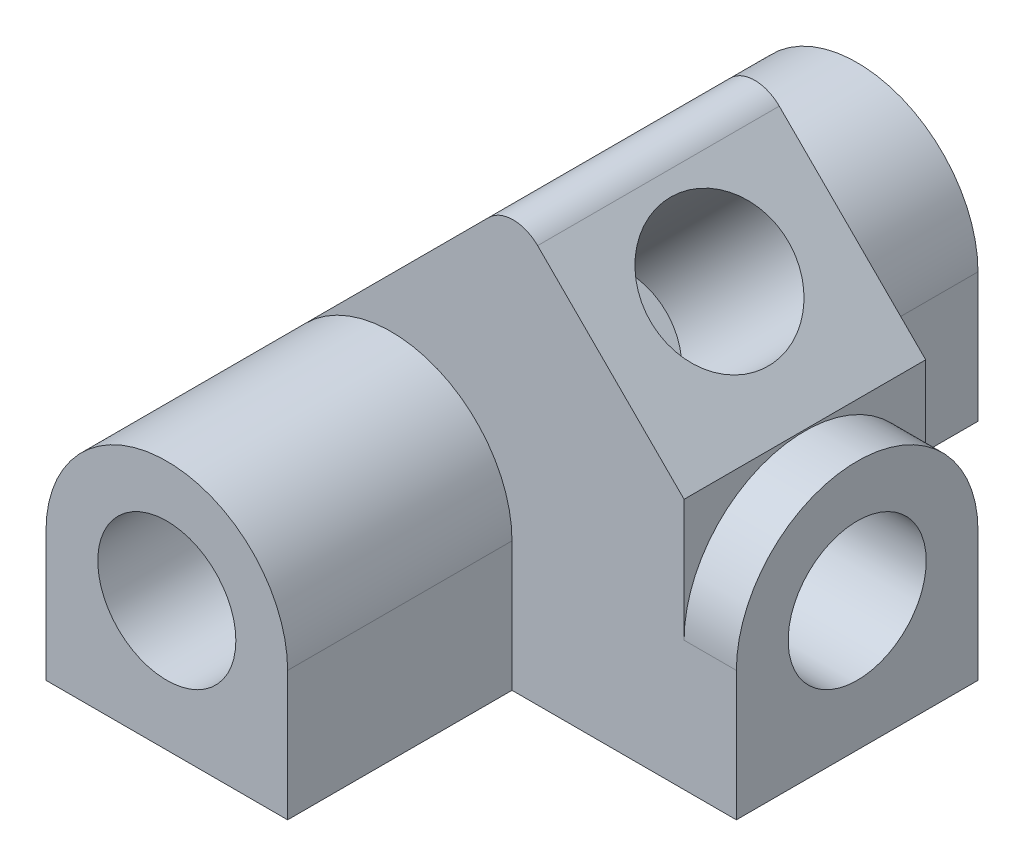
ISO-10303-21;
HEADER;
FILE_DESCRIPTION(('STEP AP214'),'2;1');
FILE_NAME('part.step','',(''),(''),'','','');
FILE_SCHEMA(('AUTOMOTIVE_DESIGN { 1 0 10303 214 1 1 1 1 }'));
ENDSEC;
DATA;
#1=APPLICATION_CONTEXT('core data for automotive mechanical design processes');
#2=APPLICATION_PROTOCOL_DEFINITION('international standard','automotive_design',2000,#1);
#3=PRODUCT_CONTEXT('',#1,'mechanical');
#4=PRODUCT('Part','Part','',(#3));
#5=PRODUCT_RELATED_PRODUCT_CATEGORY('part','',(#4));
#6=PRODUCT_DEFINITION_FORMATION('','',#4);
#7=PRODUCT_DEFINITION_CONTEXT('part definition',#1,'design');
#8=PRODUCT_DEFINITION('design','',#6,#7);
#9=PRODUCT_DEFINITION_SHAPE('','',#8);
#10=(LENGTH_UNIT() NAMED_UNIT(*) SI_UNIT(.MILLI.,.METRE.));
#11=(NAMED_UNIT(*) PLANE_ANGLE_UNIT() SI_UNIT($,.RADIAN.));
#12=(NAMED_UNIT(*) SI_UNIT($,.STERADIAN.) SOLID_ANGLE_UNIT());
#13=UNCERTAINTY_MEASURE_WITH_UNIT(LENGTH_MEASURE(1.E-05),#10,'distance_accuracy_value','');
#14=(GEOMETRIC_REPRESENTATION_CONTEXT(3) GLOBAL_UNCERTAINTY_ASSIGNED_CONTEXT((#13)) GLOBAL_UNIT_ASSIGNED_CONTEXT((#10,
#11,#12)) REPRESENTATION_CONTEXT('',''));
#15=CARTESIAN_POINT('',(0.,0.,0.));
#16=DIRECTION('',(0.,0.,1.));
#17=DIRECTION('',(1.,0.,0.));
#18=AXIS2_PLACEMENT_3D('',#15,#16,#17);
#19=CARTESIAN_POINT('',(7.07106781186538,16.9705627484772,-7.));
#20=DIRECTION('',(0.707106781186551,-0.707106781186544,0.));
#21=DIRECTION('',(0.707106781186544,0.707106781186551,0.));
#22=AXIS2_PLACEMENT_3D('',#19,#20,#21);
#23=PLANE('',#22);
#24=DIRECTION('',(-0.707106781186544,-0.707106781186551,0.));
#25=VECTOR('',#24,1.);
#26=CARTESIAN_POINT('',(7.07106781186538,16.9705627484772,7.));
#27=LINE('',#26,#25);
#28=CARTESIAN_POINT('',(5.6568542494923,15.5563491861041,7.));
#29=VERTEX_POINT('',#28);
#30=CARTESIAN_POINT('',(-4.94974746830586,4.94974746830581,7.));
#31=VERTEX_POINT('',#30);
#32=EDGE_CURVE('E351',#29,#31,#27,.T.);
#33=ORIENTED_EDGE('',*,*,#32,.F.);
#34=DIRECTION('',(0.,0.,1.));
#35=VECTOR('',#34,1.);
#36=CARTESIAN_POINT('',(5.6568542494923,15.5563491861041,-7.));
#37=LINE('',#36,#35);
#38=CARTESIAN_POINT('',(5.6568542494923,15.5563491861041,-7.));
#39=VERTEX_POINT('',#38);
#40=EDGE_CURVE('E48',#29,#39,#37,.F.);
#41=ORIENTED_EDGE('',*,*,#40,.T.);
#42=DIRECTION('',(-0.707106781186544,-0.707106781186551,0.));
#43=VECTOR('',#42,1.);
#44=CARTESIAN_POINT('',(7.07106781186538,16.9705627484772,-7.));
#45=LINE('',#44,#43);
#46=CARTESIAN_POINT('',(-4.94974746830586,4.94974746830581,-7.));
#47=VERTEX_POINT('',#46);
#48=EDGE_CURVE('E354',#39,#47,#45,.T.);
#49=ORIENTED_EDGE('',*,*,#48,.T.);
#50=DIRECTION('',(0.,0.,1.));
#51=VECTOR('',#50,1.);
#52=CARTESIAN_POINT('',(-4.94974746830586,4.94974746830581,-20.));
#53=LINE('',#52,#51);
#54=EDGE_CURVE('E332',#47,#31,#53,.T.);
#55=ORIENTED_EDGE('',*,*,#54,.T.);
#56=EDGE_LOOP('',(#33,#41,#49,#55));
#57=FACE_BOUND('',#56,.T.);
#58=DIRECTION('',(0.707106781186544,0.707106781186551,0.));
#59=VECTOR('',#58,1.);
#60=CARTESIAN_POINT('',(-2.82842712474623,7.07106781186546,-2.07596153846154));
#61=LINE('',#60,#59);
#62=CARTESIAN_POINT('',(-2.82842712474623,7.07106781186546,-2.07596153846154));
#63=VERTEX_POINT('',#62);
#64=CARTESIAN_POINT('',(3.9067649660556,13.8062599026674,-2.07596153846154));
#65=VERTEX_POINT('',#64);
#66=EDGE_CURVE('E55',#63,#65,#61,.T.);
#67=ORIENTED_EDGE('',*,*,#66,.T.);
#68=DIRECTION('',(0.,0.,1.));
#69=VECTOR('',#68,1.);
#70=CARTESIAN_POINT('',(3.9067649660556,13.8062599026674,-2.07596153846154));
#71=LINE('',#70,#69);
#72=CARTESIAN_POINT('',(3.9067649660556,13.8062599026674,2.56442307692307));
#73=VERTEX_POINT('',#72);
#74=EDGE_CURVE('E216',#65,#73,#71,.T.);
#75=ORIENTED_EDGE('',*,*,#74,.T.);
#76=DIRECTION('',(-0.707106781186543,-0.707106781186552,0.));
#77=VECTOR('',#76,1.);
#78=CARTESIAN_POINT('',(3.9067649660556,13.8062599026674,2.56442307692307));
#79=LINE('',#78,#77);
#80=CARTESIAN_POINT('',(2.69788433437322,12.597379270985,2.56442307692307));
#81=VERTEX_POINT('',#80);
#82=EDGE_CURVE('E782',#73,#81,#79,.T.);
#83=ORIENTED_EDGE('',*,*,#82,.T.);
#84=DIRECTION('',(0.,0.,-1.));
#85=VECTOR('',#84,1.);
#86=CARTESIAN_POINT('',(2.69788433437322,12.597379270985,2.56442307692307));
#87=LINE('',#86,#85);
#88=CARTESIAN_POINT('',(2.69788433437322,12.597379270985,-0.366346153846155));
#89=VERTEX_POINT('',#88);
#90=EDGE_CURVE('E784',#81,#89,#87,.T.);
#91=ORIENTED_EDGE('',*,*,#90,.T.);
#92=DIRECTION('',(-0.707106781186544,-0.707106781186551,0.));
#93=VECTOR('',#92,1.);
#94=CARTESIAN_POINT('',(2.69788433437322,12.597379270985,-0.366346153846155));
#95=LINE('',#94,#93);
#96=CARTESIAN_POINT('',(1.4026550861421,11.3021500227538,-0.366346153846155));
#97=VERTEX_POINT('',#96);
#98=EDGE_CURVE('E789',#89,#97,#95,.T.);
#99=ORIENTED_EDGE('',*,*,#98,.T.);
#100=DIRECTION('',(0.,0.,1.));
#101=VECTOR('',#100,1.);
#102=CARTESIAN_POINT('',(1.4026550861421,11.3021500227538,-0.366346153846155));
#103=LINE('',#102,#101);
#104=CARTESIAN_POINT('',(1.4026550861421,11.3021500227538,2.56442307692307));
#105=VERTEX_POINT('',#104);
#106=EDGE_CURVE('E799',#97,#105,#103,.T.);
#107=ORIENTED_EDGE('',*,*,#106,.T.);
#108=DIRECTION('',(-0.707106781186544,-0.707106781186551,0.));
#109=VECTOR('',#108,1.);
#110=CARTESIAN_POINT('',(1.4026550861421,11.3021500227538,2.56442307692307));
#111=LINE('',#110,#109);
#112=CARTESIAN_POINT('',(0.193774454459721,10.0932693910714,2.56442307692307));
#113=VERTEX_POINT('',#112);
#114=EDGE_CURVE('E754',#105,#113,#111,.T.);
#115=ORIENTED_EDGE('',*,*,#114,.T.);
#116=DIRECTION('',(0.,0.,-1.));
#117=VECTOR('',#116,1.);
#118=CARTESIAN_POINT('',(0.193774454459721,10.0932693910714,2.56442307692307));
#119=LINE('',#118,#117);
#120=CARTESIAN_POINT('',(0.193774454459721,10.0932693910714,-0.366346153846155));
#121=VERTEX_POINT('',#120);
#122=EDGE_CURVE('E749',#113,#121,#119,.T.);
#123=ORIENTED_EDGE('',*,*,#122,.T.);
#124=DIRECTION('',(-0.707106781186544,-0.707106781186551,0.));
#125=VECTOR('',#124,1.);
#126=CARTESIAN_POINT('',(0.193774454459721,10.0932693910714,-0.366346153846155));
#127=LINE('',#126,#125);
#128=CARTESIAN_POINT('',(-2.82842712474623,7.07106781186546,-0.366346153846155));
#129=VERTEX_POINT('',#128);
#130=EDGE_CURVE('E743',#121,#129,#127,.T.);
#131=ORIENTED_EDGE('',*,*,#130,.T.);
#132=DIRECTION('',(0.,0.,-1.));
#133=VECTOR('',#132,1.);
#134=CARTESIAN_POINT('',(-2.82842712474623,7.07106781186546,-0.366346153846155));
#135=LINE('',#134,#133);
#136=EDGE_CURVE('E212',#129,#63,#135,.T.);
#137=ORIENTED_EDGE('',*,*,#136,.T.);
#138=EDGE_LOOP('',(#67,#75,#83,#91,#99,#107,#115,#123,#131,#137));
#139=FACE_BOUND('',#138,.T.);
#140=ADVANCED_FACE('F39',(#57,#139),#23,.F.);
#141=CARTESIAN_POINT('',(20.,0.,0.));
#142=DIRECTION('',(-1.,0.,0.));
#143=DIRECTION('',(0.,0.,1.));
#144=AXIS2_PLACEMENT_3D('',#141,#142,#143);
#145=CYLINDRICAL_SURFACE('',#144,7.);
#146=CARTESIAN_POINT('',(16.9705627484771,0.,0.));
#147=DIRECTION('',(-1.,0.,0.));
#148=DIRECTION('',(0.,-1.,0.));
#149=AXIS2_PLACEMENT_3D('',#146,#147,#148);
#150=CIRCLE('',#149,7.);
#151=CARTESIAN_POINT('',(16.9705627484771,0.,-7.));
#152=VERTEX_POINT('',#151);
#153=CARTESIAN_POINT('',(16.9705627484771,0.,7.));
#154=VERTEX_POINT('',#153);
#155=EDGE_CURVE('E237',#152,#154,#150,.F.);
#156=ORIENTED_EDGE('',*,*,#155,.T.);
#157=DIRECTION('',(-1.,0.,0.));
#158=VECTOR('',#157,1.);
#159=CARTESIAN_POINT('',(20.,0.,7.));
#160=LINE('',#159,#158);
#161=CARTESIAN_POINT('',(20.,0.,7.));
#162=VERTEX_POINT('',#161);
#163=EDGE_CURVE('E287',#154,#162,#160,.F.);
#164=ORIENTED_EDGE('',*,*,#163,.T.);
#165=CARTESIAN_POINT('',(20.,0.,0.));
#166=DIRECTION('',(1.,0.,0.));
#167=DIRECTION('',(0.,0.,-1.));
#168=AXIS2_PLACEMENT_3D('',#165,#166,#167);
#169=CIRCLE('',#168,7.);
#170=CARTESIAN_POINT('',(20.,0.,-7.));
#171=VERTEX_POINT('',#170);
#172=EDGE_CURVE('E321',#171,#162,#169,.T.);
#173=ORIENTED_EDGE('',*,*,#172,.F.);
#174=DIRECTION('',(-1.,0.,0.));
#175=VECTOR('',#174,1.);
#176=CARTESIAN_POINT('',(20.,0.,-7.));
#177=LINE('',#176,#175);
#178=EDGE_CURVE('E306',#152,#171,#177,.F.);
#179=ORIENTED_EDGE('',*,*,#178,.F.);
#180=EDGE_LOOP('',(#156,#164,#173,#179));
#181=FACE_BOUND('',#180,.T.);
#182=ADVANCED_FACE('F407',(#181),#145,.T.);
#183=CARTESIAN_POINT('',(0.,0.,-20.));
#184=DIRECTION('',(0.,0.,1.));
#185=DIRECTION('',(1.,0.,0.));
#186=AXIS2_PLACEMENT_3D('',#183,#184,#185);
#187=CYLINDRICAL_SURFACE('',#186,7.);
#188=CARTESIAN_POINT('',(0.,0.,-7.));
#189=DIRECTION('',(0.,0.,-1.));
#190=DIRECTION('',(-1.,0.,0.));
#191=AXIS2_PLACEMENT_3D('',#188,#189,#190);
#192=CIRCLE('',#191,7.);
#193=CARTESIAN_POINT('',(7.,0.,-7.));
#194=VERTEX_POINT('',#193);
#195=EDGE_CURVE('E328',#47,#194,#192,.T.);
#196=ORIENTED_EDGE('',*,*,#195,.T.);
#197=DIRECTION('',(0.,0.,1.));
#198=VECTOR('',#197,1.);
#199=CARTESIAN_POINT('',(7.,0.,-20.));
#200=LINE('',#199,#198);
#201=CARTESIAN_POINT('',(7.,0.,-20.));
#202=VERTEX_POINT('',#201);
#203=EDGE_CURVE('E309',#202,#194,#200,.T.);
#204=ORIENTED_EDGE('',*,*,#203,.F.);
#205=CARTESIAN_POINT('',(0.,0.,-20.));
#206=DIRECTION('',(0.,0.,1.));
#207=DIRECTION('',(1.,0.,0.));
#208=AXIS2_PLACEMENT_3D('',#205,#206,#207);
#209=CIRCLE('',#208,7.);
#210=CARTESIAN_POINT('',(-7.,0.,-20.));
#211=VERTEX_POINT('',#210);
#212=EDGE_CURVE('E369',#202,#211,#209,.T.);
#213=ORIENTED_EDGE('',*,*,#212,.T.);
#214=DIRECTION('',(0.,0.,1.));
#215=VECTOR('',#214,1.);
#216=CARTESIAN_POINT('',(-7.,0.,-20.));
#217=LINE('',#216,#215);
#218=CARTESIAN_POINT('',(-7.,0.,20.));
#219=VERTEX_POINT('',#218);
#220=EDGE_CURVE('E305',#211,#219,#217,.T.);
#221=ORIENTED_EDGE('',*,*,#220,.T.);
#222=CARTESIAN_POINT('',(0.,0.,20.));
#223=DIRECTION('',(0.,0.,1.));
#224=DIRECTION('',(1.,0.,0.));
#225=AXIS2_PLACEMENT_3D('',#222,#223,#224);
#226=CIRCLE('',#225,7.);
#227=CARTESIAN_POINT('',(7.,0.,20.));
#228=VERTEX_POINT('',#227);
#229=EDGE_CURVE('E361',#228,#219,#226,.T.);
#230=ORIENTED_EDGE('',*,*,#229,.F.);
#231=DIRECTION('',(0.,0.,1.));
#232=VECTOR('',#231,1.);
#233=CARTESIAN_POINT('',(7.,0.,-20.));
#234=LINE('',#233,#232);
#235=CARTESIAN_POINT('',(7.,0.,7.));
#236=VERTEX_POINT('',#235);
#237=EDGE_CURVE('E300',#236,#228,#234,.T.);
#238=ORIENTED_EDGE('',*,*,#237,.F.);
#239=CARTESIAN_POINT('',(0.,0.,7.));
#240=DIRECTION('',(0.,0.,1.));
#241=DIRECTION('',(1.,0.,0.));
#242=AXIS2_PLACEMENT_3D('',#239,#240,#241);
#243=CIRCLE('',#242,7.);
#244=EDGE_CURVE('E333',#236,#31,#243,.T.);
#245=ORIENTED_EDGE('',*,*,#244,.T.);
#246=ORIENTED_EDGE('',*,*,#54,.F.);
#247=EDGE_LOOP('',(#196,#204,#213,#221,#230,#238,#245,#246));
#248=FACE_BOUND('',#247,.T.);
#249=ADVANCED_FACE('F420',(#248),#187,.T.);
#250=CARTESIAN_POINT('',(7.07106781186538,16.9705627484772,7.));
#251=DIRECTION('',(0.,0.,-1.));
#252=DIRECTION('',(-1.,0.,0.));
#253=AXIS2_PLACEMENT_3D('',#250,#251,#252);
#254=PLANE('',#253);
#255=DIRECTION('',(0.707106781186551,-0.707106781186544,0.));
#256=VECTOR('',#255,1.);
#257=CARTESIAN_POINT('',(7.07106781186538,16.9705627484772,7.));
#258=LINE('',#257,#256);
#259=CARTESIAN_POINT('',(8.48528137423849,15.5563491861041,7.));
#260=VERTEX_POINT('',#259);
#261=CARTESIAN_POINT('',(16.9705627484771,7.07106781186556,7.));
#262=VERTEX_POINT('',#261);
#263=EDGE_CURVE('E337',#260,#262,#258,.T.);
#264=ORIENTED_EDGE('',*,*,#263,.F.);
#265=CARTESIAN_POINT('',(7.0710678118654,14.142135623731,7.));
#266=DIRECTION('',(0.,0.,-1.));
#267=DIRECTION('',(-1.,0.,0.));
#268=AXIS2_PLACEMENT_3D('',#265,#266,#267);
#269=CIRCLE('',#268,2.);
#270=EDGE_CURVE('E377',#260,#29,#269,.F.);
#271=ORIENTED_EDGE('',*,*,#270,.T.);
#272=ORIENTED_EDGE('',*,*,#32,.T.);
#273=ORIENTED_EDGE('',*,*,#244,.F.);
#274=DIRECTION('',(0.,-1.,0.));
#275=VECTOR('',#274,1.);
#276=CARTESIAN_POINT('',(7.,16.9725627484772,7.));
#277=LINE('',#276,#275);
#278=CARTESIAN_POINT('',(7.,-7.5,7.));
#279=VERTEX_POINT('',#278);
#280=EDGE_CURVE('E283',#236,#279,#277,.T.);
#281=ORIENTED_EDGE('',*,*,#280,.T.);
#282=DIRECTION('',(1.,0.,0.));
#283=VECTOR('',#282,1.);
#284=CARTESIAN_POINT('',(20.,-7.5,7.));
#285=LINE('',#284,#283);
#286=CARTESIAN_POINT('',(20.,-7.5,7.));
#287=VERTEX_POINT('',#286);
#288=EDGE_CURVE('E266',#279,#287,#285,.T.);
#289=ORIENTED_EDGE('',*,*,#288,.T.);
#290=DIRECTION('',(0.,-1.,0.));
#291=VECTOR('',#290,1.);
#292=CARTESIAN_POINT('',(20.,16.9725627484772,7.));
#293=LINE('',#292,#291);
#294=EDGE_CURVE('E279',#162,#287,#293,.T.);
#295=ORIENTED_EDGE('',*,*,#294,.F.);
#296=ORIENTED_EDGE('',*,*,#163,.F.);
#297=DIRECTION('',(0.,1.,0.));
#298=VECTOR('',#297,1.);
#299=CARTESIAN_POINT('',(16.9705627484771,-7.502,7.));
#300=LINE('',#299,#298);
#301=EDGE_CURVE('E232',#154,#262,#300,.T.);
#302=ORIENTED_EDGE('',*,*,#301,.T.);
#303=EDGE_LOOP('',(#264,#271,#272,#273,#281,#289,#295,#296,#302));
#304=FACE_BOUND('',#303,.T.);
#305=ADVANCED_FACE('F382',(#304),#254,.F.);
#306=CARTESIAN_POINT('',(7.07106781186538,16.9705627484772,-7.));
#307=DIRECTION('',(0.,0.,1.));
#308=DIRECTION('',(1.,0.,0.));
#309=AXIS2_PLACEMENT_3D('',#306,#307,#308);
#310=PLANE('',#309);
#311=ORIENTED_EDGE('',*,*,#48,.F.);
#312=CARTESIAN_POINT('',(7.0710678118654,14.142135623731,-7.));
#313=DIRECTION('',(0.,0.,1.));
#314=DIRECTION('',(1.,0.,0.));
#315=AXIS2_PLACEMENT_3D('',#312,#313,#314);
#316=CIRCLE('',#315,2.);
#317=CARTESIAN_POINT('',(8.48528137423849,15.5563491861041,-7.));
#318=VERTEX_POINT('',#317);
#319=EDGE_CURVE('E11',#39,#318,#316,.F.);
#320=ORIENTED_EDGE('',*,*,#319,.T.);
#321=DIRECTION('',(-0.707106781186551,0.707106781186544,0.));
#322=VECTOR('',#321,1.);
#323=CARTESIAN_POINT('',(7.07106781186538,16.9705627484772,-7.));
#324=LINE('',#323,#322);
#325=CARTESIAN_POINT('',(16.9705627484771,7.07106781186556,-7.));
#326=VERTEX_POINT('',#325);
#327=EDGE_CURVE('E347',#326,#318,#324,.T.);
#328=ORIENTED_EDGE('',*,*,#327,.F.);
#329=DIRECTION('',(0.,1.,0.));
#330=VECTOR('',#329,1.);
#331=CARTESIAN_POINT('',(16.9705627484771,-7.502,-7.));
#332=LINE('',#331,#330);
#333=EDGE_CURVE('E234',#152,#326,#332,.T.);
#334=ORIENTED_EDGE('',*,*,#333,.F.);
#335=ORIENTED_EDGE('',*,*,#178,.T.);
#336=DIRECTION('',(0.,-1.,0.));
#337=VECTOR('',#336,1.);
#338=CARTESIAN_POINT('',(20.,16.9725627484772,-7.));
#339=LINE('',#338,#337);
#340=CARTESIAN_POINT('',(20.,-7.5,-7.));
#341=VERTEX_POINT('',#340);
#342=EDGE_CURVE('E259',#171,#341,#339,.T.);
#343=ORIENTED_EDGE('',*,*,#342,.T.);
#344=DIRECTION('',(-1.,0.,0.));
#345=VECTOR('',#344,1.);
#346=CARTESIAN_POINT('',(7.,-7.5,-7.));
#347=LINE('',#346,#345);
#348=CARTESIAN_POINT('',(7.,-7.5,-7.));
#349=VERTEX_POINT('',#348);
#350=EDGE_CURVE('E244',#341,#349,#347,.T.);
#351=ORIENTED_EDGE('',*,*,#350,.T.);
#352=DIRECTION('',(0.,-1.,0.));
#353=VECTOR('',#352,1.);
#354=CARTESIAN_POINT('',(7.,16.9725627484772,-7.));
#355=LINE('',#354,#353);
#356=EDGE_CURVE('E297',#194,#349,#355,.T.);
#357=ORIENTED_EDGE('',*,*,#356,.F.);
#358=ORIENTED_EDGE('',*,*,#195,.F.);
#359=EDGE_LOOP('',(#311,#320,#328,#334,#335,#343,#351,#357,#358));
#360=FACE_BOUND('',#359,.T.);
#361=ADVANCED_FACE('F391',(#360),#310,.F.);
#362=CARTESIAN_POINT('',(0.,0.,-20.));
#363=DIRECTION('',(0.,0.,1.));
#364=DIRECTION('',(1.,0.,0.));
#365=AXIS2_PLACEMENT_3D('',#362,#363,#364);
#366=PLANE('',#365);
#367=CARTESIAN_POINT('',(0.,0.,-20.));
#368=DIRECTION('',(0.,0.,1.));
#369=DIRECTION('',(1.,0.,0.));
#370=AXIS2_PLACEMENT_3D('',#367,#368,#369);
#371=CIRCLE('',#370,4.);
#372=CARTESIAN_POINT('',(4.,0.,-20.));
#373=VERTEX_POINT('',#372);
#374=EDGE_CURVE('E365',#373,#373,#371,.T.);
#375=ORIENTED_EDGE('',*,*,#374,.T.);
#376=EDGE_LOOP('',(#375));
#377=FACE_BOUND('',#376,.T.);
#378=ORIENTED_EDGE('',*,*,#212,.F.);
#379=DIRECTION('',(0.,-1.,0.));
#380=VECTOR('',#379,1.);
#381=CARTESIAN_POINT('',(7.,16.9725627484772,-20.));
#382=LINE('',#381,#380);
#383=CARTESIAN_POINT('',(7.,-7.5,-20.));
#384=VERTEX_POINT('',#383);
#385=EDGE_CURVE('E296',#202,#384,#382,.T.);
#386=ORIENTED_EDGE('',*,*,#385,.T.);
#387=DIRECTION('',(-1.,0.,0.));
#388=VECTOR('',#387,1.);
#389=CARTESIAN_POINT('',(-7.,-7.5,-20.));
#390=LINE('',#389,#388);
#391=CARTESIAN_POINT('',(-7.,-7.5,-20.));
#392=VERTEX_POINT('',#391);
#393=EDGE_CURVE('E249',#384,#392,#390,.T.);
#394=ORIENTED_EDGE('',*,*,#393,.T.);
#395=DIRECTION('',(0.,-1.,0.));
#396=VECTOR('',#395,1.);
#397=CARTESIAN_POINT('',(-7.,16.9725627484772,-20.));
#398=LINE('',#397,#396);
#399=EDGE_CURVE('E293',#211,#392,#398,.T.);
#400=ORIENTED_EDGE('',*,*,#399,.F.);
#401=EDGE_LOOP('',(#378,#386,#394,#400));
#402=FACE_BOUND('',#401,.T.);
#403=ADVANCED_FACE('F436',(#377,#402),#366,.F.);
#404=CARTESIAN_POINT('',(0.,0.,-20.));
#405=DIRECTION('',(0.,0.,1.));
#406=DIRECTION('',(1.,0.,0.));
#407=AXIS2_PLACEMENT_3D('',#404,#405,#406);
#408=CYLINDRICAL_SURFACE('',#407,4.);
#409=CARTESIAN_POINT('',(0.,0.,20.));
#410=DIRECTION('',(0.,0.,1.));
#411=DIRECTION('',(1.,0.,0.));
#412=AXIS2_PLACEMENT_3D('',#409,#410,#411);
#413=CIRCLE('',#412,4.);
#414=CARTESIAN_POINT('',(4.,0.,20.));
#415=VERTEX_POINT('',#414);
#416=EDGE_CURVE('E357',#415,#415,#413,.T.);
#417=ORIENTED_EDGE('',*,*,#416,.T.);
#418=EDGE_LOOP('',(#417));
#419=FACE_BOUND('',#418,.T.);
#420=ORIENTED_EDGE('',*,*,#374,.F.);
#421=EDGE_LOOP('',(#420));
#422=FACE_BOUND('',#421,.T.);
#423=ADVANCED_FACE('F467',(#419,#422),#408,.F.);
#424=CARTESIAN_POINT('',(0.,0.,20.));
#425=DIRECTION('',(0.,0.,1.));
#426=DIRECTION('',(1.,0.,0.));
#427=AXIS2_PLACEMENT_3D('',#424,#425,#426);
#428=PLANE('',#427);
#429=ORIENTED_EDGE('',*,*,#229,.T.);
#430=DIRECTION('',(0.,-1.,0.));
#431=VECTOR('',#430,1.);
#432=CARTESIAN_POINT('',(-7.,16.9725627484772,20.));
#433=LINE('',#432,#431);
#434=CARTESIAN_POINT('',(-7.,-7.5,20.));
#435=VERTEX_POINT('',#434);
#436=EDGE_CURVE('E290',#219,#435,#433,.T.);
#437=ORIENTED_EDGE('',*,*,#436,.T.);
#438=DIRECTION('',(1.,0.,0.));
#439=VECTOR('',#438,1.);
#440=CARTESIAN_POINT('',(-7.,-7.5,20.));
#441=LINE('',#440,#439);
#442=CARTESIAN_POINT('',(7.,-7.5,20.));
#443=VERTEX_POINT('',#442);
#444=EDGE_CURVE('E250',#435,#443,#441,.T.);
#445=ORIENTED_EDGE('',*,*,#444,.T.);
#446=DIRECTION('',(0.,-1.,0.));
#447=VECTOR('',#446,1.);
#448=CARTESIAN_POINT('',(7.,16.9725627484772,20.));
#449=LINE('',#448,#447);
#450=EDGE_CURVE('E282',#228,#443,#449,.T.);
#451=ORIENTED_EDGE('',*,*,#450,.F.);
#452=EDGE_LOOP('',(#429,#437,#445,#451));
#453=FACE_BOUND('',#452,.T.);
#454=ORIENTED_EDGE('',*,*,#416,.F.);
#455=EDGE_LOOP('',(#454));
#456=FACE_BOUND('',#455,.T.);
#457=ADVANCED_FACE('F428',(#453,#456),#428,.T.);
#458=CARTESIAN_POINT('',(12.0208152801712,12.0208152801714,0.));
#459=DIRECTION('',(-0.707106781186544,-0.707106781186551,0.));
#460=DIRECTION('',(0.707106781186551,-0.707106781186544,0.));
#461=AXIS2_PLACEMENT_3D('',#458,#459,#460);
#462=PLANE('',#461);
#463=CARTESIAN_POINT('',(12.0208152801712,12.0208152801714,0.));
#464=DIRECTION('',(0.707106781186544,0.707106781186551,0.));
#465=DIRECTION('',(-0.707106781186551,0.707106781186544,0.));
#466=AXIS2_PLACEMENT_3D('',#463,#464,#465);
#467=CIRCLE('',#466,4.);
#468=CARTESIAN_POINT('',(9.19238815542504,14.8492424049175,0.));
#469=VERTEX_POINT('',#468);
#470=EDGE_CURVE('E286',#469,#469,#467,.T.);
#471=ORIENTED_EDGE('',*,*,#470,.F.);
#472=EDGE_LOOP('',(#471));
#473=FACE_BOUND('',#472,.T.);
#474=ORIENTED_EDGE('',*,*,#327,.T.);
#475=DIRECTION('',(0.,0.,1.));
#476=VECTOR('',#475,1.);
#477=CARTESIAN_POINT('',(8.48528137423849,15.5563491861041,0.));
#478=LINE('',#477,#476);
#479=EDGE_CURVE('E373',#318,#260,#478,.T.);
#480=ORIENTED_EDGE('',*,*,#479,.T.);
#481=ORIENTED_EDGE('',*,*,#263,.T.);
#482=DIRECTION('',(0.,0.,-1.));
#483=VECTOR('',#482,1.);
#484=CARTESIAN_POINT('',(16.9705627484771,7.07106781186556,-7.));
#485=LINE('',#484,#483);
#486=EDGE_CURVE('E343',#262,#326,#485,.T.);
#487=ORIENTED_EDGE('',*,*,#486,.T.);
#488=EDGE_LOOP('',(#474,#480,#481,#487));
#489=FACE_BOUND('',#488,.T.);
#490=ADVANCED_FACE('F394',(#473,#489),#462,.F.);
#491=CARTESIAN_POINT('',(20.,0.,0.));
#492=DIRECTION('',(1.,0.,0.));
#493=DIRECTION('',(0.,0.,-1.));
#494=AXIS2_PLACEMENT_3D('',#491,#492,#493);
#495=PLANE('',#494);
#496=CARTESIAN_POINT('',(20.,0.,0.));
#497=DIRECTION('',(1.,0.,0.));
#498=DIRECTION('',(0.,0.,-1.));
#499=AXIS2_PLACEMENT_3D('',#496,#497,#498);
#500=CIRCLE('',#499,4.);
#501=CARTESIAN_POINT('',(20.,0.,-4.));
#502=VERTEX_POINT('',#501);
#503=EDGE_CURVE('E218',#502,#502,#500,.T.);
#504=ORIENTED_EDGE('',*,*,#503,.F.);
#505=EDGE_LOOP('',(#504));
#506=FACE_BOUND('',#505,.T.);
#507=ORIENTED_EDGE('',*,*,#172,.T.);
#508=ORIENTED_EDGE('',*,*,#294,.T.);
#509=DIRECTION('',(0.,0.,-1.));
#510=VECTOR('',#509,1.);
#511=CARTESIAN_POINT('',(20.,-7.5,-7.));
#512=LINE('',#511,#510);
#513=EDGE_CURVE('E270',#287,#341,#512,.T.);
#514=ORIENTED_EDGE('',*,*,#513,.T.);
#515=ORIENTED_EDGE('',*,*,#342,.F.);
#516=EDGE_LOOP('',(#507,#508,#514,#515));
#517=FACE_BOUND('',#516,.T.);
#518=ADVANCED_FACE('F404',(#506,#517),#495,.T.);
#519=CARTESIAN_POINT('',(4.94974746830581,4.94974746830586,0.));
#520=DIRECTION('',(0.707106781186544,0.707106781186551,0.));
#521=DIRECTION('',(-0.707106781186551,0.707106781186544,0.));
#522=AXIS2_PLACEMENT_3D('',#519,#520,#521);
#523=CYLINDRICAL_SURFACE('',#522,4.);
#524=CARTESIAN_POINT('',(4.94974746830581,4.94974746830586,0.));
#525=DIRECTION('',(0.707106781186544,0.707106781186551,0.));
#526=DIRECTION('',(-0.707106781186551,0.707106781186544,0.));
#527=AXIS2_PLACEMENT_3D('',#524,#525,#526);
#528=CIRCLE('',#527,4.);
#529=CARTESIAN_POINT('',(2.1213203435596,7.77817459305204,0.));
#530=VERTEX_POINT('',#529);
#531=EDGE_CURVE('E317',#530,#530,#528,.T.);
#532=ORIENTED_EDGE('',*,*,#531,.F.);
#533=EDGE_LOOP('',(#532));
#534=FACE_BOUND('',#533,.T.);
#535=ORIENTED_EDGE('',*,*,#470,.T.);
#536=EDGE_LOOP('',(#535));
#537=FACE_BOUND('',#536,.T.);
#538=ADVANCED_FACE('F446',(#534,#537),#523,.F.);
#539=CARTESIAN_POINT('',(4.94974746830581,4.94974746830586,0.));
#540=DIRECTION('',(0.707106781186544,0.707106781186551,0.));
#541=DIRECTION('',(-0.707106781186551,0.707106781186544,0.));
#542=AXIS2_PLACEMENT_3D('',#539,#540,#541);
#543=PLANE('',#542);
#544=ORIENTED_EDGE('',*,*,#531,.T.);
#545=EDGE_LOOP('',(#544));
#546=FACE_BOUND('',#545,.T.);
#547=ADVANCED_FACE('F439',(#546),#543,.T.);
#548=CARTESIAN_POINT('',(7.,16.9725627484772,-20.));
#549=DIRECTION('',(-1.,0.,0.));
#550=DIRECTION('',(0.,0.,1.));
#551=AXIS2_PLACEMENT_3D('',#548,#549,#550);
#552=PLANE('',#551);
#553=ORIENTED_EDGE('',*,*,#385,.F.);
#554=ORIENTED_EDGE('',*,*,#203,.T.);
#555=ORIENTED_EDGE('',*,*,#356,.T.);
#556=DIRECTION('',(0.,0.,-1.));
#557=VECTOR('',#556,1.);
#558=CARTESIAN_POINT('',(7.,-7.5,-20.));
#559=LINE('',#558,#557);
#560=EDGE_CURVE('E255',#349,#384,#559,.T.);
#561=ORIENTED_EDGE('',*,*,#560,.T.);
#562=EDGE_LOOP('',(#553,#554,#555,#561));
#563=FACE_BOUND('',#562,.T.);
#564=ADVANCED_FACE('F437',(#563),#552,.F.);
#565=CARTESIAN_POINT('',(-7.,16.9725627484772,-20.));
#566=DIRECTION('',(1.,0.,0.));
#567=DIRECTION('',(0.,0.,-1.));
#568=AXIS2_PLACEMENT_3D('',#565,#566,#567);
#569=PLANE('',#568);
#570=ORIENTED_EDGE('',*,*,#220,.F.);
#571=ORIENTED_EDGE('',*,*,#399,.T.);
#572=DIRECTION('',(0.,0.,1.));
#573=VECTOR('',#572,1.);
#574=CARTESIAN_POINT('',(-7.,-7.5,-20.));
#575=LINE('',#574,#573);
#576=EDGE_CURVE('E245',#392,#435,#575,.T.);
#577=ORIENTED_EDGE('',*,*,#576,.T.);
#578=ORIENTED_EDGE('',*,*,#436,.F.);
#579=EDGE_LOOP('',(#570,#571,#577,#578));
#580=FACE_BOUND('',#579,.T.);
#581=ADVANCED_FACE('F433',(#580),#569,.F.);
#582=CARTESIAN_POINT('',(7.,16.9725627484772,7.));
#583=DIRECTION('',(-1.,0.,0.));
#584=DIRECTION('',(0.,0.,1.));
#585=AXIS2_PLACEMENT_3D('',#582,#583,#584);
#586=PLANE('',#585);
#587=ORIENTED_EDGE('',*,*,#280,.F.);
#588=ORIENTED_EDGE('',*,*,#237,.T.);
#589=ORIENTED_EDGE('',*,*,#450,.T.);
#590=DIRECTION('',(0.,0.,-1.));
#591=VECTOR('',#590,1.);
#592=CARTESIAN_POINT('',(7.,-7.5,7.));
#593=LINE('',#592,#591);
#594=EDGE_CURVE('E254',#443,#279,#593,.T.);
#595=ORIENTED_EDGE('',*,*,#594,.T.);
#596=EDGE_LOOP('',(#587,#588,#589,#595));
#597=FACE_BOUND('',#596,.T.);
#598=ADVANCED_FACE('F426',(#597),#586,.F.);
#599=CARTESIAN_POINT('',(0.,-7.5,0.));
#600=DIRECTION('',(0.,-1.,0.));
#601=DIRECTION('',(0.,0.,-1.));
#602=AXIS2_PLACEMENT_3D('',#599,#600,#601);
#603=PLANE('',#602);
#604=ORIENTED_EDGE('',*,*,#350,.F.);
#605=ORIENTED_EDGE('',*,*,#513,.F.);
#606=ORIENTED_EDGE('',*,*,#288,.F.);
#607=ORIENTED_EDGE('',*,*,#594,.F.);
#608=ORIENTED_EDGE('',*,*,#444,.F.);
#609=ORIENTED_EDGE('',*,*,#576,.F.);
#610=ORIENTED_EDGE('',*,*,#393,.F.);
#611=ORIENTED_EDGE('',*,*,#560,.F.);
#612=EDGE_LOOP('',(#604,#605,#606,#607,#608,#609,#610,#611));
#613=FACE_BOUND('',#612,.T.);
#614=ADVANCED_FACE('F413',(#613),#603,.T.);
#615=CARTESIAN_POINT('',(16.9705627484771,-7.502,7.));
#616=DIRECTION('',(-1.,0.,0.));
#617=DIRECTION('',(0.,-1.,0.));
#618=AXIS2_PLACEMENT_3D('',#615,#616,#617);
#619=PLANE('',#618);
#620=ORIENTED_EDGE('',*,*,#155,.F.);
#621=ORIENTED_EDGE('',*,*,#333,.T.);
#622=ORIENTED_EDGE('',*,*,#486,.F.);
#623=ORIENTED_EDGE('',*,*,#301,.F.);
#624=EDGE_LOOP('',(#620,#621,#622,#623));
#625=FACE_BOUND('',#624,.T.);
#626=ADVANCED_FACE('F398',(#625),#619,.F.);
#627=CARTESIAN_POINT('',(10.,0.,0.));
#628=DIRECTION('',(1.,0.,0.));
#629=DIRECTION('',(0.,0.,-1.));
#630=AXIS2_PLACEMENT_3D('',#627,#628,#629);
#631=CYLINDRICAL_SURFACE('',#630,4.);
#632=CARTESIAN_POINT('',(10.,0.,0.));
#633=DIRECTION('',(1.,0.,0.));
#634=DIRECTION('',(0.,0.,-1.));
#635=AXIS2_PLACEMENT_3D('',#632,#633,#634);
#636=CIRCLE('',#635,4.);
#637=CARTESIAN_POINT('',(10.,0.,-4.));
#638=VERTEX_POINT('',#637);
#639=EDGE_CURVE('E224',#638,#638,#636,.T.);
#640=ORIENTED_EDGE('',*,*,#639,.F.);
#641=EDGE_LOOP('',(#640));
#642=FACE_BOUND('',#641,.T.);
#643=ORIENTED_EDGE('',*,*,#503,.T.);
#644=EDGE_LOOP('',(#643));
#645=FACE_BOUND('',#644,.T.);
#646=ADVANCED_FACE('F451',(#642,#645),#631,.F.);
#647=CARTESIAN_POINT('',(10.,0.,0.));
#648=DIRECTION('',(1.,0.,0.));
#649=DIRECTION('',(0.,0.,-1.));
#650=AXIS2_PLACEMENT_3D('',#647,#648,#649);
#651=PLANE('',#650);
#652=ORIENTED_EDGE('',*,*,#639,.T.);
#653=EDGE_LOOP('',(#652));
#654=FACE_BOUND('',#653,.T.);
#655=ADVANCED_FACE('F564',(#654),#651,.T.);
#656=CARTESIAN_POINT('',(7.0710678118654,14.142135623731,0.));
#657=DIRECTION('',(0.,0.,1.));
#658=DIRECTION('',(1.,0.,0.));
#659=AXIS2_PLACEMENT_3D('',#656,#657,#658);
#660=CYLINDRICAL_SURFACE('',#659,2.);
#661=ORIENTED_EDGE('',*,*,#319,.F.);
#662=ORIENTED_EDGE('',*,*,#40,.F.);
#663=ORIENTED_EDGE('',*,*,#270,.F.);
#664=ORIENTED_EDGE('',*,*,#479,.F.);
#665=EDGE_LOOP('',(#661,#662,#663,#664));
#666=FACE_BOUND('',#665,.T.);
#667=ADVANCED_FACE('F41',(#666),#660,.T.);
#668=CARTESIAN_POINT('',(-2.82842712474623,6.07106781186546,-2.07596153846154));
#669=DIRECTION('',(0.,0.,1.));
#670=DIRECTION('',(1.,0.,0.));
#671=AXIS2_PLACEMENT_3D('',#668,#669,#670);
#672=PLANE('',#671);
#673=ORIENTED_EDGE('',*,*,#66,.F.);
#674=DIRECTION('',(0.,1.,0.));
#675=VECTOR('',#674,1.);
#676=CARTESIAN_POINT('',(-2.82842712474623,6.07106781186546,-2.07596153846154));
#677=LINE('',#676,#675);
#678=CARTESIAN_POINT('',(-2.82842712474623,6.07106781186546,-2.07596153846154));
#679=VERTEX_POINT('',#678);
#680=EDGE_CURVE('E210',#679,#63,#677,.T.);
#681=ORIENTED_EDGE('',*,*,#680,.F.);
#682=DIRECTION('',(0.707106781186544,0.707106781186551,0.));
#683=VECTOR('',#682,1.);
#684=CARTESIAN_POINT('',(-2.82842712474623,6.07106781186546,-2.07596153846154));
#685=LINE('',#684,#683);
#686=CARTESIAN_POINT('',(3.9067649660556,12.8062599026674,-2.07596153846154));
#687=VERTEX_POINT('',#686);
#688=EDGE_CURVE('E200',#679,#687,#685,.T.);
#689=ORIENTED_EDGE('',*,*,#688,.T.);
#690=DIRECTION('',(0.,1.,0.));
#691=VECTOR('',#690,1.);
#692=CARTESIAN_POINT('',(3.9067649660556,12.8062599026674,-2.07596153846154));
#693=LINE('',#692,#691);
#694=EDGE_CURVE('E209',#687,#65,#693,.T.);
#695=ORIENTED_EDGE('',*,*,#694,.T.);
#696=EDGE_LOOP('',(#673,#681,#689,#695));
#697=FACE_BOUND('',#696,.T.);
#698=ADVANCED_FACE('F208',(#697),#672,.T.);
#699=CARTESIAN_POINT('',(3.9067649660556,12.8062599026674,-2.07596153846154));
#700=DIRECTION('',(-1.,0.,0.));
#701=DIRECTION('',(0.,0.,1.));
#702=AXIS2_PLACEMENT_3D('',#699,#700,#701);
#703=PLANE('',#702);
#704=ORIENTED_EDGE('',*,*,#74,.F.);
#705=ORIENTED_EDGE('',*,*,#694,.F.);
#706=DIRECTION('',(0.,0.,1.));
#707=VECTOR('',#706,1.);
#708=CARTESIAN_POINT('',(3.9067649660556,12.8062599026674,-2.07596153846154));
#709=LINE('',#708,#707);
#710=CARTESIAN_POINT('',(3.9067649660556,12.8062599026674,2.56442307692307));
#711=VERTEX_POINT('',#710);
#712=EDGE_CURVE('E196',#687,#711,#709,.T.);
#713=ORIENTED_EDGE('',*,*,#712,.T.);
#714=DIRECTION('',(0.,1.,0.));
#715=VECTOR('',#714,1.);
#716=CARTESIAN_POINT('',(3.9067649660556,12.8062599026674,2.56442307692307));
#717=LINE('',#716,#715);
#718=EDGE_CURVE('E219',#711,#73,#717,.T.);
#719=ORIENTED_EDGE('',*,*,#718,.T.);
#720=EDGE_LOOP('',(#704,#705,#713,#719));
#721=FACE_BOUND('',#720,.T.);
#722=ADVANCED_FACE('F214',(#721),#703,.T.);
#723=CARTESIAN_POINT('',(3.9067649660556,12.8062599026674,2.56442307692307));
#724=DIRECTION('',(0.,0.,-1.));
#725=DIRECTION('',(-1.,0.,0.));
#726=AXIS2_PLACEMENT_3D('',#723,#724,#725);
#727=PLANE('',#726);
#728=ORIENTED_EDGE('',*,*,#82,.F.);
#729=ORIENTED_EDGE('',*,*,#718,.F.);
#730=DIRECTION('',(-0.707106781186543,-0.707106781186552,0.));
#731=VECTOR('',#730,1.);
#732=CARTESIAN_POINT('',(3.9067649660556,12.8062599026674,2.56442307692307));
#733=LINE('',#732,#731);
#734=CARTESIAN_POINT('',(2.69788433437322,11.597379270985,2.56442307692307));
#735=VERTEX_POINT('',#734);
#736=EDGE_CURVE('E202',#711,#735,#733,.T.);
#737=ORIENTED_EDGE('',*,*,#736,.T.);
#738=DIRECTION('',(0.,1.,0.));
#739=VECTOR('',#738,1.);
#740=CARTESIAN_POINT('',(2.69788433437322,11.597379270985,2.56442307692307));
#741=LINE('',#740,#739);
#742=EDGE_CURVE('E226',#735,#81,#741,.T.);
#743=ORIENTED_EDGE('',*,*,#742,.T.);
#744=EDGE_LOOP('',(#728,#729,#737,#743));
#745=FACE_BOUND('',#744,.T.);
#746=ADVANCED_FACE('F603',(#745),#727,.T.);
#747=CARTESIAN_POINT('',(2.69788433437322,11.597379270985,2.56442307692307));
#748=DIRECTION('',(1.,0.,0.));
#749=DIRECTION('',(0.,0.,-1.));
#750=AXIS2_PLACEMENT_3D('',#747,#748,#749);
#751=PLANE('',#750);
#752=ORIENTED_EDGE('',*,*,#90,.F.);
#753=ORIENTED_EDGE('',*,*,#742,.F.);
#754=DIRECTION('',(0.,0.,-1.));
#755=VECTOR('',#754,1.);
#756=CARTESIAN_POINT('',(2.69788433437322,11.597379270985,2.56442307692307));
#757=LINE('',#756,#755);
#758=CARTESIAN_POINT('',(2.69788433437322,11.597379270985,-0.366346153846155));
#759=VERTEX_POINT('',#758);
#760=EDGE_CURVE('E829',#735,#759,#757,.T.);
#761=ORIENTED_EDGE('',*,*,#760,.T.);
#762=DIRECTION('',(0.,1.,0.));
#763=VECTOR('',#762,1.);
#764=CARTESIAN_POINT('',(2.69788433437322,11.597379270985,-0.366346153846155));
#765=LINE('',#764,#763);
#766=EDGE_CURVE('E775',#759,#89,#765,.T.);
#767=ORIENTED_EDGE('',*,*,#766,.T.);
#768=EDGE_LOOP('',(#752,#753,#761,#767));
#769=FACE_BOUND('',#768,.T.);
#770=ADVANCED_FACE('F611',(#769),#751,.T.);
#771=CARTESIAN_POINT('',(2.69788433437322,11.597379270985,-0.366346153846155));
#772=DIRECTION('',(0.,0.,-1.));
#773=DIRECTION('',(-1.,0.,0.));
#774=AXIS2_PLACEMENT_3D('',#771,#772,#773);
#775=PLANE('',#774);
#776=ORIENTED_EDGE('',*,*,#98,.F.);
#777=ORIENTED_EDGE('',*,*,#766,.F.);
#778=DIRECTION('',(-0.707106781186544,-0.707106781186551,0.));
#779=VECTOR('',#778,1.);
#780=CARTESIAN_POINT('',(2.69788433437322,11.597379270985,-0.366346153846155));
#781=LINE('',#780,#779);
#782=CARTESIAN_POINT('',(1.4026550861421,10.3021500227538,-0.366346153846155));
#783=VERTEX_POINT('',#782);
#784=EDGE_CURVE('E826',#759,#783,#781,.T.);
#785=ORIENTED_EDGE('',*,*,#784,.T.);
#786=DIRECTION('',(0.,1.,0.));
#787=VECTOR('',#786,1.);
#788=CARTESIAN_POINT('',(1.4026550861421,10.3021500227538,-0.366346153846155));
#789=LINE('',#788,#787);
#790=EDGE_CURVE('E772',#783,#97,#789,.T.);
#791=ORIENTED_EDGE('',*,*,#790,.T.);
#792=EDGE_LOOP('',(#776,#777,#785,#791));
#793=FACE_BOUND('',#792,.T.);
#794=ADVANCED_FACE('F620',(#793),#775,.T.);
#795=CARTESIAN_POINT('',(1.4026550861421,10.3021500227538,-0.366346153846155));
#796=DIRECTION('',(-1.,0.,0.));
#797=DIRECTION('',(0.,0.,1.));
#798=AXIS2_PLACEMENT_3D('',#795,#796,#797);
#799=PLANE('',#798);
#800=ORIENTED_EDGE('',*,*,#106,.F.);
#801=ORIENTED_EDGE('',*,*,#790,.F.);
#802=DIRECTION('',(0.,0.,1.));
#803=VECTOR('',#802,1.);
#804=CARTESIAN_POINT('',(1.4026550861421,10.3021500227538,-0.366346153846155));
#805=LINE('',#804,#803);
#806=CARTESIAN_POINT('',(1.4026550861421,10.3021500227538,2.56442307692307));
#807=VERTEX_POINT('',#806);
#808=EDGE_CURVE('E823',#783,#807,#805,.T.);
#809=ORIENTED_EDGE('',*,*,#808,.T.);
#810=DIRECTION('',(0.,1.,0.));
#811=VECTOR('',#810,1.);
#812=CARTESIAN_POINT('',(1.4026550861421,10.3021500227538,2.56442307692307));
#813=LINE('',#812,#811);
#814=EDGE_CURVE('E769',#807,#105,#813,.T.);
#815=ORIENTED_EDGE('',*,*,#814,.T.);
#816=EDGE_LOOP('',(#800,#801,#809,#815));
#817=FACE_BOUND('',#816,.T.);
#818=ADVANCED_FACE('F629',(#817),#799,.T.);
#819=CARTESIAN_POINT('',(1.4026550861421,10.3021500227538,2.56442307692307));
#820=DIRECTION('',(0.,0.,-1.));
#821=DIRECTION('',(-1.,0.,0.));
#822=AXIS2_PLACEMENT_3D('',#819,#820,#821);
#823=PLANE('',#822);
#824=ORIENTED_EDGE('',*,*,#114,.F.);
#825=ORIENTED_EDGE('',*,*,#814,.F.);
#826=DIRECTION('',(-0.707106781186544,-0.707106781186551,0.));
#827=VECTOR('',#826,1.);
#828=CARTESIAN_POINT('',(1.4026550861421,10.3021500227538,2.56442307692307));
#829=LINE('',#828,#827);
#830=CARTESIAN_POINT('',(0.193774454459721,9.09326939107144,2.56442307692307));
#831=VERTEX_POINT('',#830);
#832=EDGE_CURVE('E808',#807,#831,#829,.T.);
#833=ORIENTED_EDGE('',*,*,#832,.T.);
#834=DIRECTION('',(0.,1.,0.));
#835=VECTOR('',#834,1.);
#836=CARTESIAN_POINT('',(0.193774454459721,9.09326939107144,2.56442307692307));
#837=LINE('',#836,#835);
#838=EDGE_CURVE('E766',#831,#113,#837,.T.);
#839=ORIENTED_EDGE('',*,*,#838,.T.);
#840=EDGE_LOOP('',(#824,#825,#833,#839));
#841=FACE_BOUND('',#840,.T.);
#842=ADVANCED_FACE('F638',(#841),#823,.T.);
#843=CARTESIAN_POINT('',(0.193774454459721,9.09326939107144,2.56442307692307));
#844=DIRECTION('',(1.,0.,0.));
#845=DIRECTION('',(0.,0.,-1.));
#846=AXIS2_PLACEMENT_3D('',#843,#844,#845);
#847=PLANE('',#846);
#848=ORIENTED_EDGE('',*,*,#122,.F.);
#849=ORIENTED_EDGE('',*,*,#838,.F.);
#850=DIRECTION('',(0.,0.,-1.));
#851=VECTOR('',#850,1.);
#852=CARTESIAN_POINT('',(0.193774454459721,9.09326939107144,2.56442307692307));
#853=LINE('',#852,#851);
#854=CARTESIAN_POINT('',(0.193774454459721,9.09326939107144,-0.366346153846155));
#855=VERTEX_POINT('',#854);
#856=EDGE_CURVE('E810',#831,#855,#853,.T.);
#857=ORIENTED_EDGE('',*,*,#856,.T.);
#858=DIRECTION('',(0.,1.,0.));
#859=VECTOR('',#858,1.);
#860=CARTESIAN_POINT('',(0.193774454459721,9.09326939107144,-0.366346153846155));
#861=LINE('',#860,#859);
#862=EDGE_CURVE('E763',#855,#121,#861,.T.);
#863=ORIENTED_EDGE('',*,*,#862,.T.);
#864=EDGE_LOOP('',(#848,#849,#857,#863));
#865=FACE_BOUND('',#864,.T.);
#866=ADVANCED_FACE('F647',(#865),#847,.T.);
#867=CARTESIAN_POINT('',(0.193774454459721,9.09326939107144,-0.366346153846155));
#868=DIRECTION('',(0.,0.,-1.));
#869=DIRECTION('',(-1.,0.,0.));
#870=AXIS2_PLACEMENT_3D('',#867,#868,#869);
#871=PLANE('',#870);
#872=ORIENTED_EDGE('',*,*,#130,.F.);
#873=ORIENTED_EDGE('',*,*,#862,.F.);
#874=DIRECTION('',(-0.707106781186544,-0.707106781186551,0.));
#875=VECTOR('',#874,1.);
#876=CARTESIAN_POINT('',(0.193774454459721,9.09326939107144,-0.366346153846155));
#877=LINE('',#876,#875);
#878=CARTESIAN_POINT('',(-2.82842712474623,6.07106781186546,-0.366346153846155));
#879=VERTEX_POINT('',#878);
#880=EDGE_CURVE('E812',#855,#879,#877,.T.);
#881=ORIENTED_EDGE('',*,*,#880,.T.);
#882=DIRECTION('',(0.,1.,0.));
#883=VECTOR('',#882,1.);
#884=CARTESIAN_POINT('',(-2.82842712474623,6.07106781186546,-0.366346153846155));
#885=LINE('',#884,#883);
#886=EDGE_CURVE('E741',#879,#129,#885,.T.);
#887=ORIENTED_EDGE('',*,*,#886,.T.);
#888=EDGE_LOOP('',(#872,#873,#881,#887));
#889=FACE_BOUND('',#888,.T.);
#890=ADVANCED_FACE('F656',(#889),#871,.T.);
#891=CARTESIAN_POINT('',(-2.82842712474623,6.07106781186546,-0.366346153846155));
#892=DIRECTION('',(1.,0.,0.));
#893=DIRECTION('',(0.,0.,-1.));
#894=AXIS2_PLACEMENT_3D('',#891,#892,#893);
#895=PLANE('',#894);
#896=ORIENTED_EDGE('',*,*,#136,.F.);
#897=ORIENTED_EDGE('',*,*,#886,.F.);
#898=DIRECTION('',(0.,0.,-1.));
#899=VECTOR('',#898,1.);
#900=CARTESIAN_POINT('',(-2.82842712474623,6.07106781186546,-0.366346153846155));
#901=LINE('',#900,#899);
#902=EDGE_CURVE('E760',#879,#679,#901,.T.);
#903=ORIENTED_EDGE('',*,*,#902,.T.);
#904=ORIENTED_EDGE('',*,*,#680,.T.);
#905=EDGE_LOOP('',(#896,#897,#903,#904));
#906=FACE_BOUND('',#905,.T.);
#907=ADVANCED_FACE('F665',(#906),#895,.T.);
#908=CARTESIAN_POINT('',(-4.94974746830586,3.94974746830581,0.));
#909=DIRECTION('',(0.707106781186551,-0.707106781186544,0.));
#910=DIRECTION('',(0.707106781186544,0.707106781186551,0.));
#911=AXIS2_PLACEMENT_3D('',#908,#909,#910);
#912=PLANE('',#911);
#913=ORIENTED_EDGE('',*,*,#688,.F.);
#914=ORIENTED_EDGE('',*,*,#902,.F.);
#915=ORIENTED_EDGE('',*,*,#880,.F.);
#916=ORIENTED_EDGE('',*,*,#856,.F.);
#917=ORIENTED_EDGE('',*,*,#832,.F.);
#918=ORIENTED_EDGE('',*,*,#808,.F.);
#919=ORIENTED_EDGE('',*,*,#784,.F.);
#920=ORIENTED_EDGE('',*,*,#760,.F.);
#921=ORIENTED_EDGE('',*,*,#736,.F.);
#922=ORIENTED_EDGE('',*,*,#712,.F.);
#923=EDGE_LOOP('',(#913,#914,#915,#916,#917,#918,#919,#920,#921,#922));
#924=FACE_BOUND('',#923,.T.);
#925=ADVANCED_FACE('F198',(#924),#912,.F.);
#926=CLOSED_SHELL('',(#140,#182,#249,#305,#361,#403,#423,#457,#490,#518,#538,#547,#564,#581,
#598,#614,#626,#646,#655,#667,#698,#722,#746,#770,#794,#818,#842,#866,#890,#907,#925));
#927=MANIFOLD_SOLID_BREP('B2',#926);
#928=ADVANCED_BREP_SHAPE_REPRESENTATION('',(#18,#927),#14);
#929=SHAPE_DEFINITION_REPRESENTATION(#9,#928);
ENDSEC;
END-ISO-10303-21;
